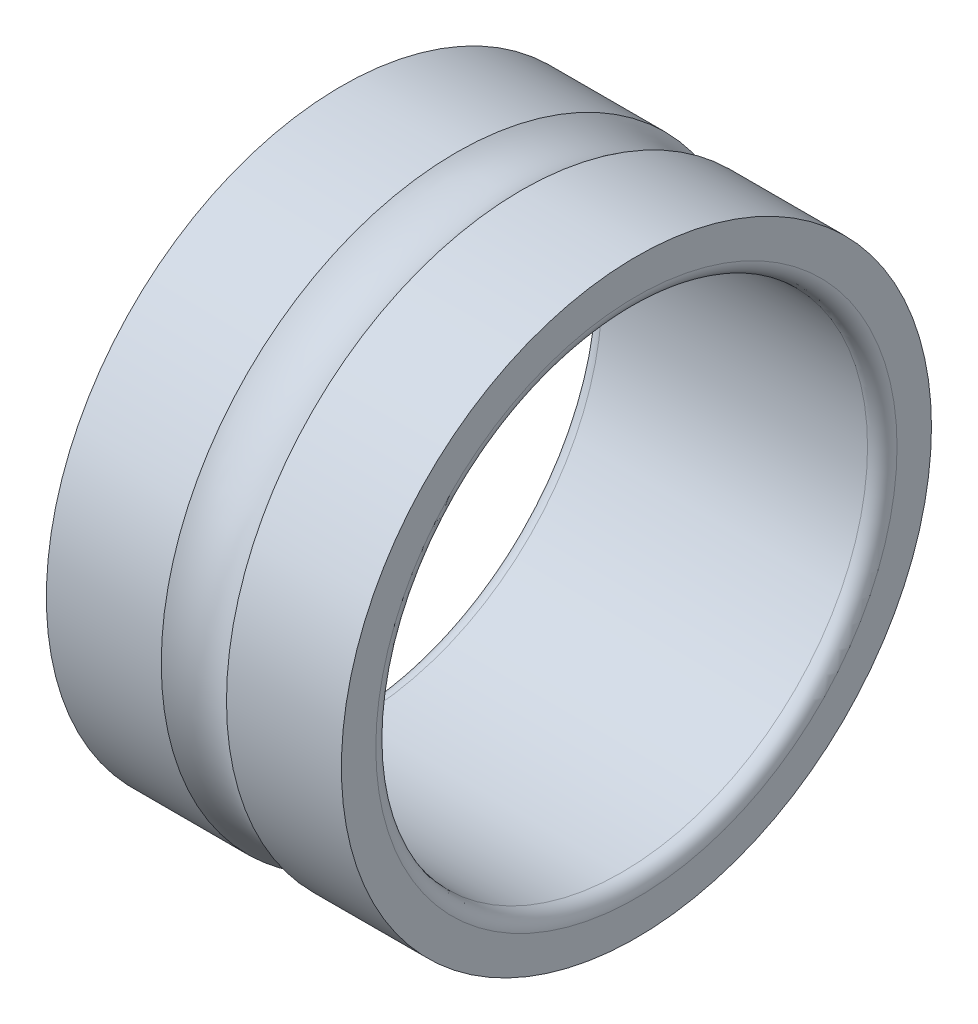
ISO-10303-21;
HEADER;
FILE_DESCRIPTION(('STEP AP214'),'2;1');
FILE_NAME('part.step','',(''),(''),'','','');
FILE_SCHEMA(('AUTOMOTIVE_DESIGN { 1 0 10303 214 1 1 1 1 }'));
ENDSEC;
DATA;
#1=APPLICATION_CONTEXT('core data for automotive mechanical design processes');
#2=APPLICATION_PROTOCOL_DEFINITION('international standard','automotive_design',2000,#1);
#3=PRODUCT_CONTEXT('',#1,'mechanical');
#4=PRODUCT('Part','Part','',(#3));
#5=PRODUCT_RELATED_PRODUCT_CATEGORY('part','',(#4));
#6=PRODUCT_DEFINITION_FORMATION('','',#4);
#7=PRODUCT_DEFINITION_CONTEXT('part definition',#1,'design');
#8=PRODUCT_DEFINITION('design','',#6,#7);
#9=PRODUCT_DEFINITION_SHAPE('','',#8);
#10=(LENGTH_UNIT() NAMED_UNIT(*) SI_UNIT(.MILLI.,.METRE.));
#11=(NAMED_UNIT(*) PLANE_ANGLE_UNIT() SI_UNIT($,.RADIAN.));
#12=(NAMED_UNIT(*) SI_UNIT($,.STERADIAN.) SOLID_ANGLE_UNIT());
#13=UNCERTAINTY_MEASURE_WITH_UNIT(LENGTH_MEASURE(1.E-05),#10,'distance_accuracy_value','');
#14=(GEOMETRIC_REPRESENTATION_CONTEXT(3) GLOBAL_UNCERTAINTY_ASSIGNED_CONTEXT((#13)) GLOBAL_UNIT_ASSIGNED_CONTEXT((#10,
#11,#12)) REPRESENTATION_CONTEXT('',''));
#15=CARTESIAN_POINT('',(0.,0.,0.));
#16=DIRECTION('',(0.,0.,1.));
#17=DIRECTION('',(1.,0.,0.));
#18=AXIS2_PLACEMENT_3D('',#15,#16,#17);
#19=CARTESIAN_POINT('',(3.,-3.001,3.001));
#20=DIRECTION('',(1.,0.,0.));
#21=DIRECTION('',(0.,0.,-1.));
#22=AXIS2_PLACEMENT_3D('',#19,#20,#21);
#23=PLANE('',#22);
#24=CARTESIAN_POINT('',(3.,0.,0.));
#25=DIRECTION('',(1.,0.,0.));
#26=DIRECTION('',(0.,0.,-1.));
#27=AXIS2_PLACEMENT_3D('',#24,#25,#26);
#28=CIRCLE('',#27,2.65);
#29=CARTESIAN_POINT('',(3.,0.,-2.65));
#30=VERTEX_POINT('',#29);
#31=EDGE_CURVE('E33',#30,#30,#28,.T.);
#32=ORIENTED_EDGE('',*,*,#31,.F.);
#33=EDGE_LOOP('',(#32));
#34=FACE_BOUND('',#33,.T.);
#35=CARTESIAN_POINT('',(3.,0.,0.));
#36=DIRECTION('',(1.,0.,0.));
#37=DIRECTION('',(0.,0.,-1.));
#38=AXIS2_PLACEMENT_3D('',#35,#36,#37);
#39=CIRCLE('',#38,3.);
#40=CARTESIAN_POINT('',(3.,0.,-3.));
#41=VERTEX_POINT('',#40);
#42=EDGE_CURVE('E19',#41,#41,#39,.F.);
#43=ORIENTED_EDGE('',*,*,#42,.F.);
#44=EDGE_LOOP('',(#43));
#45=FACE_BOUND('',#44,.T.);
#46=ADVANCED_FACE('F15',(#34,#45),#23,.T.);
#47=CARTESIAN_POINT('',(1.83166247903554,0.,0.));
#48=DIRECTION('',(1.,0.,0.));
#49=DIRECTION('',(0.,0.,-1.));
#50=AXIS2_PLACEMENT_3D('',#47,#48,#49);
#51=CYLINDRICAL_SURFACE('',#50,3.);
#52=ORIENTED_EDGE('',*,*,#42,.T.);
#53=EDGE_LOOP('',(#52));
#54=FACE_BOUND('',#53,.T.);
#55=CARTESIAN_POINT('',(1.83166247903554,0.,0.));
#56=DIRECTION('',(-1.,0.,0.));
#57=DIRECTION('',(0.,0.,1.));
#58=AXIS2_PLACEMENT_3D('',#55,#56,#57);
#59=CIRCLE('',#58,3.);
#60=CARTESIAN_POINT('',(1.83166247903554,0.,3.));
#61=VERTEX_POINT('',#60);
#62=EDGE_CURVE('E35',#61,#61,#59,.T.);
#63=ORIENTED_EDGE('',*,*,#62,.F.);
#64=EDGE_LOOP('',(#63));
#65=FACE_BOUND('',#64,.T.);
#66=ADVANCED_FACE('F43',(#54,#65),#51,.T.);
#67=CARTESIAN_POINT('',(2.85,0.,0.));
#68=DIRECTION('',(1.,0.,0.));
#69=DIRECTION('',(0.,0.,-1.));
#70=AXIS2_PLACEMENT_3D('',#67,#68,#69);
#71=TOROIDAL_SURFACE('',#70,2.65,0.15);
#72=ORIENTED_EDGE('',*,*,#31,.T.);
#73=EDGE_LOOP('',(#72));
#74=FACE_BOUND('',#73,.T.);
#75=CARTESIAN_POINT('',(2.85,0.,0.));
#76=DIRECTION('',(1.,0.,0.));
#77=DIRECTION('',(0.,0.,-1.));
#78=AXIS2_PLACEMENT_3D('',#75,#76,#77);
#79=CIRCLE('',#78,2.5);
#80=CARTESIAN_POINT('',(2.85,0.,-2.5));
#81=VERTEX_POINT('',#80);
#82=EDGE_CURVE('E39',#81,#81,#79,.T.);
#83=ORIENTED_EDGE('',*,*,#82,.F.);
#84=EDGE_LOOP('',(#83));
#85=FACE_BOUND('',#84,.T.);
#86=ADVANCED_FACE('F53',(#74,#85),#71,.T.);
#87=CARTESIAN_POINT('',(1.5,0.,0.));
#88=DIRECTION('',(1.,0.,0.));
#89=DIRECTION('',(0.,0.,-1.));
#90=AXIS2_PLACEMENT_3D('',#87,#88,#89);
#91=TOROIDAL_SURFACE('',#90,3.5,0.600000000000001);
#92=CARTESIAN_POINT('',(1.16833752096446,0.,0.));
#93=DIRECTION('',(-1.,0.,0.));
#94=DIRECTION('',(0.,0.,1.));
#95=AXIS2_PLACEMENT_3D('',#92,#93,#94);
#96=CIRCLE('',#95,3.);
#97=CARTESIAN_POINT('',(1.16833752096446,0.,3.));
#98=VERTEX_POINT('',#97);
#99=EDGE_CURVE('E87',#98,#98,#96,.T.);
#100=ORIENTED_EDGE('',*,*,#99,.F.);
#101=EDGE_LOOP('',(#100));
#102=FACE_BOUND('',#101,.T.);
#103=ORIENTED_EDGE('',*,*,#62,.T.);
#104=EDGE_LOOP('',(#103));
#105=FACE_BOUND('',#104,.T.);
#106=ADVANCED_FACE('F72',(#102,#105),#91,.F.);
#107=CARTESIAN_POINT('',(2.85,0.,0.));
#108=DIRECTION('',(-1.,0.,0.));
#109=DIRECTION('',(0.,0.,1.));
#110=AXIS2_PLACEMENT_3D('',#107,#108,#109);
#111=CYLINDRICAL_SURFACE('',#110,2.5);
#112=CARTESIAN_POINT('',(0.150000000000001,0.,0.));
#113=DIRECTION('',(1.,0.,0.));
#114=DIRECTION('',(0.,0.,-1.));
#115=AXIS2_PLACEMENT_3D('',#112,#113,#114);
#116=CIRCLE('',#115,2.5);
#117=CARTESIAN_POINT('',(0.150000000000001,0.,-2.5));
#118=VERTEX_POINT('',#117);
#119=EDGE_CURVE('E28',#118,#118,#116,.T.);
#120=ORIENTED_EDGE('',*,*,#119,.F.);
#121=EDGE_LOOP('',(#120));
#122=FACE_BOUND('',#121,.T.);
#123=ORIENTED_EDGE('',*,*,#82,.T.);
#124=EDGE_LOOP('',(#123));
#125=FACE_BOUND('',#124,.T.);
#126=ADVANCED_FACE('F66',(#122,#125),#111,.F.);
#127=CARTESIAN_POINT('',(0.,0.,0.));
#128=DIRECTION('',(1.,0.,0.));
#129=DIRECTION('',(0.,0.,-1.));
#130=AXIS2_PLACEMENT_3D('',#127,#128,#129);
#131=CYLINDRICAL_SURFACE('',#130,3.);
#132=ORIENTED_EDGE('',*,*,#99,.T.);
#133=EDGE_LOOP('',(#132));
#134=FACE_BOUND('',#133,.T.);
#135=CARTESIAN_POINT('',(0.,0.,0.));
#136=DIRECTION('',(1.,0.,0.));
#137=DIRECTION('',(0.,0.,-1.));
#138=AXIS2_PLACEMENT_3D('',#135,#136,#137);
#139=CIRCLE('',#138,3.);
#140=CARTESIAN_POINT('',(0.,0.,-3.));
#141=VERTEX_POINT('',#140);
#142=EDGE_CURVE('E23',#141,#141,#139,.F.);
#143=ORIENTED_EDGE('',*,*,#142,.F.);
#144=EDGE_LOOP('',(#143));
#145=FACE_BOUND('',#144,.T.);
#146=ADVANCED_FACE('F60',(#134,#145),#131,.T.);
#147=CARTESIAN_POINT('',(0.150000000000001,0.,0.));
#148=DIRECTION('',(1.,0.,0.));
#149=DIRECTION('',(0.,0.,-1.));
#150=AXIS2_PLACEMENT_3D('',#147,#148,#149);
#151=TOROIDAL_SURFACE('',#150,2.65,0.15);
#152=ORIENTED_EDGE('',*,*,#119,.T.);
#153=EDGE_LOOP('',(#152));
#154=FACE_BOUND('',#153,.T.);
#155=CARTESIAN_POINT('',(0.,0.,0.));
#156=DIRECTION('',(1.,0.,0.));
#157=DIRECTION('',(0.,0.,-1.));
#158=AXIS2_PLACEMENT_3D('',#155,#156,#157);
#159=CIRCLE('',#158,2.65);
#160=CARTESIAN_POINT('',(0.,0.,-2.65));
#161=VERTEX_POINT('',#160);
#162=EDGE_CURVE('E10',#161,#161,#159,.T.);
#163=ORIENTED_EDGE('',*,*,#162,.F.);
#164=EDGE_LOOP('',(#163));
#165=FACE_BOUND('',#164,.T.);
#166=ADVANCED_FACE('F56',(#154,#165),#151,.T.);
#167=CARTESIAN_POINT('',(0.,-3.001,-3.001));
#168=DIRECTION('',(-1.,0.,0.));
#169=DIRECTION('',(0.,0.,1.));
#170=AXIS2_PLACEMENT_3D('',#167,#168,#169);
#171=PLANE('',#170);
#172=ORIENTED_EDGE('',*,*,#162,.T.);
#173=EDGE_LOOP('',(#172));
#174=FACE_BOUND('',#173,.T.);
#175=ORIENTED_EDGE('',*,*,#142,.T.);
#176=EDGE_LOOP('',(#175));
#177=FACE_BOUND('',#176,.T.);
#178=ADVANCED_FACE('F17',(#174,#177),#171,.T.);
#179=CLOSED_SHELL('',(#46,#66,#86,#106,#126,#146,#166,#178));
#180=MANIFOLD_SOLID_BREP('B1',#179);
#181=ADVANCED_BREP_SHAPE_REPRESENTATION('',(#18,#180),#14);
#182=SHAPE_DEFINITION_REPRESENTATION(#9,#181);
ENDSEC;
END-ISO-10303-21;
